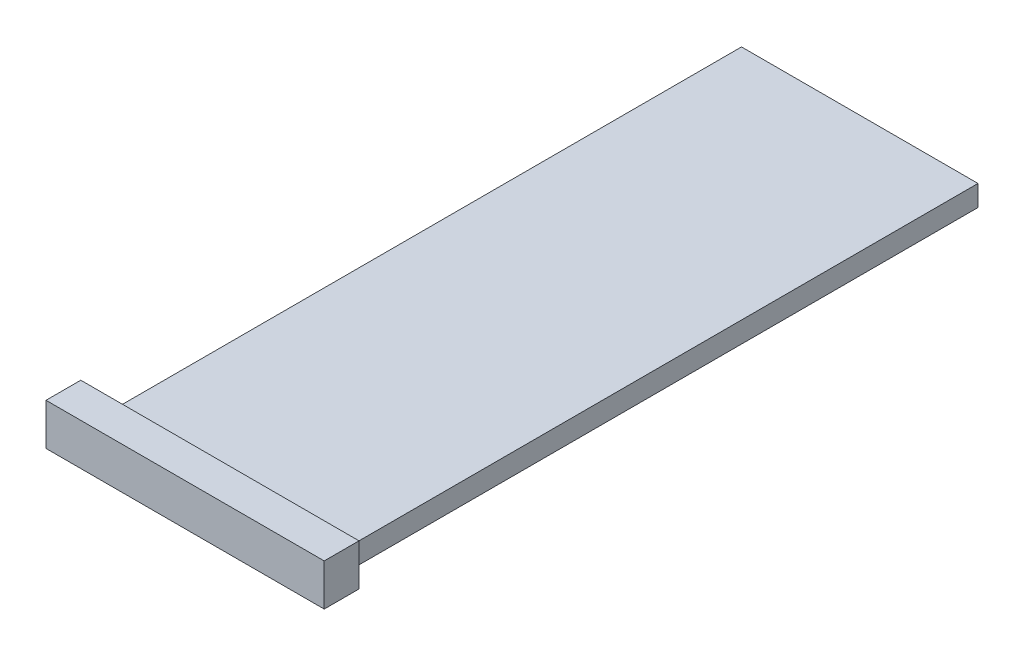
ISO-10303-21;
HEADER;
FILE_DESCRIPTION(('STEP AP214'),'2;1');
FILE_NAME('part.step','',(''),(''),'','','');
FILE_SCHEMA(('AUTOMOTIVE_DESIGN { 1 0 10303 214 1 1 1 1 }'));
ENDSEC;
DATA;
#1=APPLICATION_CONTEXT('core data for automotive mechanical design processes');
#2=APPLICATION_PROTOCOL_DEFINITION('international standard','automotive_design',2000,#1);
#3=PRODUCT_CONTEXT('',#1,'mechanical');
#4=PRODUCT('Part','Part','',(#3));
#5=PRODUCT_RELATED_PRODUCT_CATEGORY('part','',(#4));
#6=PRODUCT_DEFINITION_FORMATION('','',#4);
#7=PRODUCT_DEFINITION_CONTEXT('part definition',#1,'design');
#8=PRODUCT_DEFINITION('design','',#6,#7);
#9=PRODUCT_DEFINITION_SHAPE('','',#8);
#10=(LENGTH_UNIT() NAMED_UNIT(*) SI_UNIT(.MILLI.,.METRE.));
#11=(NAMED_UNIT(*) PLANE_ANGLE_UNIT() SI_UNIT($,.RADIAN.));
#12=(NAMED_UNIT(*) SI_UNIT($,.STERADIAN.) SOLID_ANGLE_UNIT());
#13=UNCERTAINTY_MEASURE_WITH_UNIT(LENGTH_MEASURE(1.E-05),#10,'distance_accuracy_value','');
#14=(GEOMETRIC_REPRESENTATION_CONTEXT(3) GLOBAL_UNCERTAINTY_ASSIGNED_CONTEXT((#13)) GLOBAL_UNIT_ASSIGNED_CONTEXT((#10,
#11,#12)) REPRESENTATION_CONTEXT('',''));
#15=CARTESIAN_POINT('',(0.,0.,0.));
#16=DIRECTION('',(0.,0.,1.));
#17=DIRECTION('',(1.,0.,0.));
#18=AXIS2_PLACEMENT_3D('',#15,#16,#17);
#19=CARTESIAN_POINT('',(0.,0.,-5.));
#20=DIRECTION('',(0.,0.,1.));
#21=DIRECTION('',(1.,0.,0.));
#22=AXIS2_PLACEMENT_3D('',#19,#20,#21);
#23=PLANE('',#22);
#24=DIRECTION('',(1.,0.,0.));
#25=VECTOR('',#24,1.);
#26=CARTESIAN_POINT('',(-6.10256410256411,9.46666666666667,-5.));
#27=LINE('',#26,#25);
#28=CARTESIAN_POINT('',(-40.1025641025641,9.46666666666667,-5.));
#29=VERTEX_POINT('',#28);
#30=CARTESIAN_POINT('',(-6.10256410256411,9.46666666666667,-5.));
#31=VERTEX_POINT('',#30);
#32=EDGE_CURVE('E179',#29,#31,#27,.T.);
#33=ORIENTED_EDGE('',*,*,#32,.F.);
#34=DIRECTION('',(0.,-1.,0.));
#35=VECTOR('',#34,1.);
#36=CARTESIAN_POINT('',(-40.1025641025641,9.46666666666667,-5.));
#37=LINE('',#36,#35);
#38=CARTESIAN_POINT('',(-40.1025641025641,6.46666666666667,-5.00000000000002));
#39=VERTEX_POINT('',#38);
#40=EDGE_CURVE('E11',#29,#39,#37,.T.);
#41=ORIENTED_EDGE('',*,*,#40,.T.);
#42=DIRECTION('',(1.,0.,0.));
#43=VECTOR('',#42,1.);
#44=CARTESIAN_POINT('',(-43.1025641025641,6.46666666666666,-5.00000000000002));
#45=LINE('',#44,#43);
#46=CARTESIAN_POINT('',(-43.1025641025641,6.46666666666666,-5.00000000000002));
#47=VERTEX_POINT('',#46);
#48=EDGE_CURVE('E174',#47,#39,#45,.T.);
#49=ORIENTED_EDGE('',*,*,#48,.F.);
#50=DIRECTION('',(0.,-1.,0.));
#51=VECTOR('',#50,1.);
#52=CARTESIAN_POINT('',(-43.1025641025641,9.46666666666667,-5.));
#53=LINE('',#52,#51);
#54=CARTESIAN_POINT('',(-43.1025641025641,12.4666666666667,-5.));
#55=VERTEX_POINT('',#54);
#56=EDGE_CURVE('E163',#55,#47,#53,.T.);
#57=ORIENTED_EDGE('',*,*,#56,.F.);
#58=DIRECTION('',(-1.,0.,0.));
#59=VECTOR('',#58,1.);
#60=CARTESIAN_POINT('',(-40.1025641025641,12.4666666666667,-5.));
#61=LINE('',#60,#59);
#62=CARTESIAN_POINT('',(-6.10256410256411,12.4666666666667,-5.));
#63=VERTEX_POINT('',#62);
#64=EDGE_CURVE('E208',#63,#55,#61,.T.);
#65=ORIENTED_EDGE('',*,*,#64,.F.);
#66=DIRECTION('',(0.,1.,0.));
#67=VECTOR('',#66,1.);
#68=CARTESIAN_POINT('',(-6.10256410256411,12.4666666666667,-5.));
#69=LINE('',#68,#67);
#70=EDGE_CURVE('E204',#31,#63,#69,.T.);
#71=ORIENTED_EDGE('',*,*,#70,.F.);
#72=EDGE_LOOP('',(#33,#41,#49,#57,#65,#71));
#73=FACE_BOUND('',#72,.T.);
#74=ADVANCED_FACE('F39',(#73),#23,.F.);
#75=CARTESIAN_POINT('',(-40.1025641025641,12.4666666666667,-5.));
#76=DIRECTION('',(-1.,0.,0.));
#77=DIRECTION('',(0.,-1.,0.));
#78=AXIS2_PLACEMENT_3D('',#75,#76,#77);
#79=PLANE('',#78);
#80=ORIENTED_EDGE('',*,*,#40,.F.);
#81=DIRECTION('',(0.,0.,1.));
#82=VECTOR('',#81,1.);
#83=CARTESIAN_POINT('',(-40.1025641025641,9.46666666666667,-97.));
#84=LINE('',#83,#82);
#85=CARTESIAN_POINT('',(-40.1025641025641,9.46666666666667,-97.));
#86=VERTEX_POINT('',#85);
#87=EDGE_CURVE('E127',#86,#29,#84,.T.);
#88=ORIENTED_EDGE('',*,*,#87,.F.);
#89=DIRECTION('',(0.,1.,0.));
#90=VECTOR('',#89,1.);
#91=CARTESIAN_POINT('',(-40.1025641025641,6.46666666666667,-97.));
#92=LINE('',#91,#90);
#93=CARTESIAN_POINT('',(-40.1025641025641,6.46666666666667,-97.));
#94=VERTEX_POINT('',#93);
#95=EDGE_CURVE('E188',#94,#86,#92,.T.);
#96=ORIENTED_EDGE('',*,*,#95,.F.);
#97=DIRECTION('',(0.,0.,1.));
#98=VECTOR('',#97,1.);
#99=CARTESIAN_POINT('',(-40.1025641025641,6.46666666666667,-5.));
#100=LINE('',#99,#98);
#101=EDGE_CURVE('E43',#94,#39,#100,.T.);
#102=ORIENTED_EDGE('',*,*,#101,.T.);
#103=EDGE_LOOP('',(#80,#88,#96,#102));
#104=FACE_BOUND('',#103,.T.);
#105=ADVANCED_FACE('F41',(#104),#79,.T.);
#106=CARTESIAN_POINT('',(-40.1025641025641,12.4666666666667,-5.));
#107=DIRECTION('',(0.,1.,0.));
#108=DIRECTION('',(0.,0.,1.));
#109=AXIS2_PLACEMENT_3D('',#106,#107,#108);
#110=PLANE('',#109);
#111=DIRECTION('',(-1.,0.,0.));
#112=VECTOR('',#111,1.);
#113=CARTESIAN_POINT('',(-40.1025641025641,12.4666666666667,0.));
#114=LINE('',#113,#112);
#115=CARTESIAN_POINT('',(-3.10256410256411,12.4666666666667,0.));
#116=VERTEX_POINT('',#115);
#117=CARTESIAN_POINT('',(-43.1025641025641,12.4666666666667,0.));
#118=VERTEX_POINT('',#117);
#119=EDGE_CURVE('E126',#116,#118,#114,.T.);
#120=ORIENTED_EDGE('',*,*,#119,.F.);
#121=DIRECTION('',(0.,0.,1.));
#122=VECTOR('',#121,1.);
#123=CARTESIAN_POINT('',(-3.10256410256411,12.4666666666667,0.));
#124=LINE('',#123,#122);
#125=CARTESIAN_POINT('',(-3.10256410256411,12.4666666666667,-5.00142665540085));
#126=VERTEX_POINT('',#125);
#127=EDGE_CURVE('E142',#126,#116,#124,.T.);
#128=ORIENTED_EDGE('',*,*,#127,.F.);
#129=DIRECTION('',(-1.,0.,0.));
#130=VECTOR('',#129,1.);
#131=CARTESIAN_POINT('',(-3.10256410256411,12.4666666666667,-5.00142665540085));
#132=LINE('',#131,#130);
#133=CARTESIAN_POINT('',(-6.10256410256411,12.4666666666667,-5.00142665540085));
#134=VERTEX_POINT('',#133);
#135=EDGE_CURVE('E154',#126,#134,#132,.T.);
#136=ORIENTED_EDGE('',*,*,#135,.T.);
#137=DIRECTION('',(0.,0.,1.));
#138=VECTOR('',#137,1.);
#139=CARTESIAN_POINT('',(-6.10256410256411,12.4666666666667,0.));
#140=LINE('',#139,#138);
#141=EDGE_CURVE('E144',#134,#63,#140,.T.);
#142=ORIENTED_EDGE('',*,*,#141,.T.);
#143=ORIENTED_EDGE('',*,*,#64,.T.);
#144=DIRECTION('',(0.,0.,-1.));
#145=VECTOR('',#144,1.);
#146=CARTESIAN_POINT('',(-43.1025641025641,12.4666666666667,-5.));
#147=LINE('',#146,#145);
#148=EDGE_CURVE('E171',#118,#55,#147,.T.);
#149=ORIENTED_EDGE('',*,*,#148,.F.);
#150=EDGE_LOOP('',(#120,#128,#136,#142,#143,#149));
#151=FACE_BOUND('',#150,.T.);
#152=ADVANCED_FACE('F229',(#151),#110,.T.);
#153=CARTESIAN_POINT('',(-6.10256410256411,12.4666666666667,-5.));
#154=DIRECTION('',(1.,0.,0.));
#155=DIRECTION('',(0.,0.,-1.));
#156=AXIS2_PLACEMENT_3D('',#153,#154,#155);
#157=PLANE('',#156);
#158=DIRECTION('',(0.,1.,0.));
#159=VECTOR('',#158,1.);
#160=CARTESIAN_POINT('',(-6.10256410256411,12.4666666666667,-5.00142665540085));
#161=LINE('',#160,#159);
#162=CARTESIAN_POINT('',(-6.10256410256411,6.46666666666667,-5.00142665540085));
#163=VERTEX_POINT('',#162);
#164=CARTESIAN_POINT('',(-6.10256410256411,9.46666666666667,-5.00142665540085));
#165=VERTEX_POINT('',#164);
#166=EDGE_CURVE('E57',#163,#165,#161,.T.);
#167=ORIENTED_EDGE('',*,*,#166,.F.);
#168=DIRECTION('',(0.,0.,1.));
#169=VECTOR('',#168,1.);
#170=CARTESIAN_POINT('',(-6.10256410256411,6.46666666666667,-5.));
#171=LINE('',#170,#169);
#172=CARTESIAN_POINT('',(-6.10256410256411,6.46666666666667,-97.));
#173=VERTEX_POINT('',#172);
#174=EDGE_CURVE('E49',#173,#163,#171,.T.);
#175=ORIENTED_EDGE('',*,*,#174,.F.);
#176=DIRECTION('',(0.,-1.,0.));
#177=VECTOR('',#176,1.);
#178=CARTESIAN_POINT('',(-6.10256410256411,6.46666666666667,-97.));
#179=LINE('',#178,#177);
#180=CARTESIAN_POINT('',(-6.10256410256411,9.46666666666667,-97.));
#181=VERTEX_POINT('',#180);
#182=EDGE_CURVE('E180',#181,#173,#179,.T.);
#183=ORIENTED_EDGE('',*,*,#182,.F.);
#184=DIRECTION('',(0.,0.,1.));
#185=VECTOR('',#184,1.);
#186=CARTESIAN_POINT('',(-6.10256410256411,9.46666666666667,-97.));
#187=LINE('',#186,#185);
#188=EDGE_CURVE('E198',#181,#165,#187,.T.);
#189=ORIENTED_EDGE('',*,*,#188,.T.);
#190=EDGE_LOOP('',(#167,#175,#183,#189));
#191=FACE_BOUND('',#190,.T.);
#192=ADVANCED_FACE('F256',(#191),#157,.T.);
#193=CARTESIAN_POINT('',(-40.1025641025641,6.46666666666667,-5.));
#194=DIRECTION('',(0.,-1.,0.));
#195=DIRECTION('',(0.,0.,-1.));
#196=AXIS2_PLACEMENT_3D('',#193,#194,#195);
#197=PLANE('',#196);
#198=DIRECTION('',(1.,0.,0.));
#199=VECTOR('',#198,1.);
#200=CARTESIAN_POINT('',(-40.1025641025641,6.46666666666667,0.));
#201=LINE('',#200,#199);
#202=CARTESIAN_POINT('',(-43.1025641025641,6.46666666666666,0.));
#203=VERTEX_POINT('',#202);
#204=CARTESIAN_POINT('',(-3.10256410256411,6.46666666666667,0.));
#205=VERTEX_POINT('',#204);
#206=EDGE_CURVE('E115',#203,#205,#201,.T.);
#207=ORIENTED_EDGE('',*,*,#206,.F.);
#208=DIRECTION('',(0.,0.,1.));
#209=VECTOR('',#208,1.);
#210=CARTESIAN_POINT('',(-43.1025641025641,6.46666666666666,0.));
#211=LINE('',#210,#209);
#212=EDGE_CURVE('E166',#47,#203,#211,.T.);
#213=ORIENTED_EDGE('',*,*,#212,.F.);
#214=ORIENTED_EDGE('',*,*,#48,.T.);
#215=ORIENTED_EDGE('',*,*,#101,.F.);
#216=DIRECTION('',(-1.,0.,0.));
#217=VECTOR('',#216,1.);
#218=CARTESIAN_POINT('',(-6.10256410256411,6.46666666666667,-97.));
#219=LINE('',#218,#217);
#220=EDGE_CURVE('E184',#173,#94,#219,.T.);
#221=ORIENTED_EDGE('',*,*,#220,.F.);
#222=ORIENTED_EDGE('',*,*,#174,.T.);
#223=DIRECTION('',(-1.,0.,0.));
#224=VECTOR('',#223,1.);
#225=CARTESIAN_POINT('',(-3.10256410256411,6.46666666666667,-5.00142665540085));
#226=LINE('',#225,#224);
#227=CARTESIAN_POINT('',(-3.10256410256411,6.46666666666667,-5.00142665540085));
#228=VERTEX_POINT('',#227);
#229=EDGE_CURVE('E133',#228,#163,#226,.T.);
#230=ORIENTED_EDGE('',*,*,#229,.F.);
#231=DIRECTION('',(0.,0.,-1.));
#232=VECTOR('',#231,1.);
#233=CARTESIAN_POINT('',(-3.10256410256411,6.46666666666667,0.));
#234=LINE('',#233,#232);
#235=EDGE_CURVE('E130',#205,#228,#234,.T.);
#236=ORIENTED_EDGE('',*,*,#235,.F.);
#237=EDGE_LOOP('',(#207,#213,#214,#215,#221,#222,#230,#236));
#238=FACE_BOUND('',#237,.T.);
#239=ADVANCED_FACE('F131',(#238),#197,.T.);
#240=CARTESIAN_POINT('',(0.,0.,0.));
#241=DIRECTION('',(0.,0.,1.));
#242=DIRECTION('',(1.,0.,0.));
#243=AXIS2_PLACEMENT_3D('',#240,#241,#242);
#244=PLANE('',#243);
#245=ORIENTED_EDGE('',*,*,#119,.T.);
#246=DIRECTION('',(0.,1.,0.));
#247=VECTOR('',#246,1.);
#248=CARTESIAN_POINT('',(-43.1025641025641,12.4666666666667,0.));
#249=LINE('',#248,#247);
#250=EDGE_CURVE('E121',#203,#118,#249,.T.);
#251=ORIENTED_EDGE('',*,*,#250,.F.);
#252=ORIENTED_EDGE('',*,*,#206,.T.);
#253=DIRECTION('',(0.,-1.,0.));
#254=VECTOR('',#253,1.);
#255=CARTESIAN_POINT('',(-3.10256410256411,12.4666666666667,0.));
#256=LINE('',#255,#254);
#257=EDGE_CURVE('E119',#116,#205,#256,.T.);
#258=ORIENTED_EDGE('',*,*,#257,.F.);
#259=EDGE_LOOP('',(#245,#251,#252,#258));
#260=FACE_BOUND('',#259,.T.);
#261=ADVANCED_FACE('F117',(#260),#244,.T.);
#262=CARTESIAN_POINT('',(-6.10256410256411,9.46666666666667,-97.));
#263=DIRECTION('',(0.,-1.,0.));
#264=DIRECTION('',(0.,0.,-1.));
#265=AXIS2_PLACEMENT_3D('',#262,#263,#264);
#266=PLANE('',#265);
#267=ORIENTED_EDGE('',*,*,#32,.T.);
#268=EDGE_CURVE('E194',#165,#31,#187,.T.);
#269=ORIENTED_EDGE('',*,*,#268,.F.);
#270=ORIENTED_EDGE('',*,*,#188,.F.);
#271=DIRECTION('',(1.,0.,0.));
#272=VECTOR('',#271,1.);
#273=CARTESIAN_POINT('',(-6.10256410256411,9.46666666666667,-97.));
#274=LINE('',#273,#272);
#275=EDGE_CURVE('E191',#86,#181,#274,.T.);
#276=ORIENTED_EDGE('',*,*,#275,.F.);
#277=ORIENTED_EDGE('',*,*,#87,.T.);
#278=EDGE_LOOP('',(#267,#269,#270,#276,#277));
#279=FACE_BOUND('',#278,.T.);
#280=ADVANCED_FACE('F250',(#279),#266,.F.);
#281=CARTESIAN_POINT('',(0.,0.,-97.));
#282=DIRECTION('',(0.,0.,1.));
#283=DIRECTION('',(1.,0.,0.));
#284=AXIS2_PLACEMENT_3D('',#281,#282,#283);
#285=PLANE('',#284);
#286=ORIENTED_EDGE('',*,*,#182,.T.);
#287=ORIENTED_EDGE('',*,*,#220,.T.);
#288=ORIENTED_EDGE('',*,*,#95,.T.);
#289=ORIENTED_EDGE('',*,*,#275,.T.);
#290=EDGE_LOOP('',(#286,#287,#288,#289));
#291=FACE_BOUND('',#290,.T.);
#292=ADVANCED_FACE('F273',(#291),#285,.F.);
#293=CARTESIAN_POINT('',(-43.1025641025641,0.,0.));
#294=DIRECTION('',(1.,0.,0.));
#295=DIRECTION('',(0.,0.,-1.));
#296=AXIS2_PLACEMENT_3D('',#293,#294,#295);
#297=PLANE('',#296);
#298=ORIENTED_EDGE('',*,*,#56,.T.);
#299=ORIENTED_EDGE('',*,*,#212,.T.);
#300=ORIENTED_EDGE('',*,*,#250,.T.);
#301=ORIENTED_EDGE('',*,*,#148,.T.);
#302=EDGE_LOOP('',(#298,#299,#300,#301));
#303=FACE_BOUND('',#302,.T.);
#304=ADVANCED_FACE('F220',(#303),#297,.F.);
#305=CARTESIAN_POINT('',(-6.10256410256411,0.,0.));
#306=DIRECTION('',(1.,0.,0.));
#307=DIRECTION('',(0.,0.,-1.));
#308=AXIS2_PLACEMENT_3D('',#305,#306,#307);
#309=PLANE('',#308);
#310=EDGE_CURVE('E156',#165,#134,#161,.T.);
#311=ORIENTED_EDGE('',*,*,#310,.F.);
#312=ORIENTED_EDGE('',*,*,#268,.T.);
#313=ORIENTED_EDGE('',*,*,#70,.T.);
#314=ORIENTED_EDGE('',*,*,#141,.F.);
#315=EDGE_LOOP('',(#311,#312,#313,#314));
#316=FACE_BOUND('',#315,.T.);
#317=ADVANCED_FACE('F227',(#316),#309,.F.);
#318=CARTESIAN_POINT('',(-3.10256410256411,12.4666666666667,-5.00142665540085));
#319=DIRECTION('',(0.,0.,1.));
#320=DIRECTION('',(1.,0.,0.));
#321=AXIS2_PLACEMENT_3D('',#318,#319,#320);
#322=PLANE('',#321);
#323=ORIENTED_EDGE('',*,*,#166,.T.);
#324=ORIENTED_EDGE('',*,*,#310,.T.);
#325=ORIENTED_EDGE('',*,*,#135,.F.);
#326=DIRECTION('',(0.,1.,0.));
#327=VECTOR('',#326,1.);
#328=CARTESIAN_POINT('',(-3.10256410256411,12.4666666666667,-5.00142665540085));
#329=LINE('',#328,#327);
#330=EDGE_CURVE('E137',#228,#126,#329,.T.);
#331=ORIENTED_EDGE('',*,*,#330,.F.);
#332=ORIENTED_EDGE('',*,*,#229,.T.);
#333=EDGE_LOOP('',(#323,#324,#325,#331,#332));
#334=FACE_BOUND('',#333,.T.);
#335=ADVANCED_FACE('F232',(#334),#322,.F.);
#336=CARTESIAN_POINT('',(-3.10256410256411,0.,0.));
#337=DIRECTION('',(1.,0.,0.));
#338=DIRECTION('',(0.,0.,-1.));
#339=AXIS2_PLACEMENT_3D('',#336,#337,#338);
#340=PLANE('',#339);
#341=ORIENTED_EDGE('',*,*,#257,.T.);
#342=ORIENTED_EDGE('',*,*,#235,.T.);
#343=ORIENTED_EDGE('',*,*,#330,.T.);
#344=ORIENTED_EDGE('',*,*,#127,.T.);
#345=EDGE_LOOP('',(#341,#342,#343,#344));
#346=FACE_BOUND('',#345,.T.);
#347=ADVANCED_FACE('F140',(#346),#340,.T.);
#348=CLOSED_SHELL('',(#74,#105,#152,#192,#239,#261,#280,#292,#304,#317,#335,#347));
#349=MANIFOLD_SOLID_BREP('B2',#348);
#350=ADVANCED_BREP_SHAPE_REPRESENTATION('',(#18,#349),#14);
#351=SHAPE_DEFINITION_REPRESENTATION(#9,#350);
ENDSEC;
END-ISO-10303-21;
